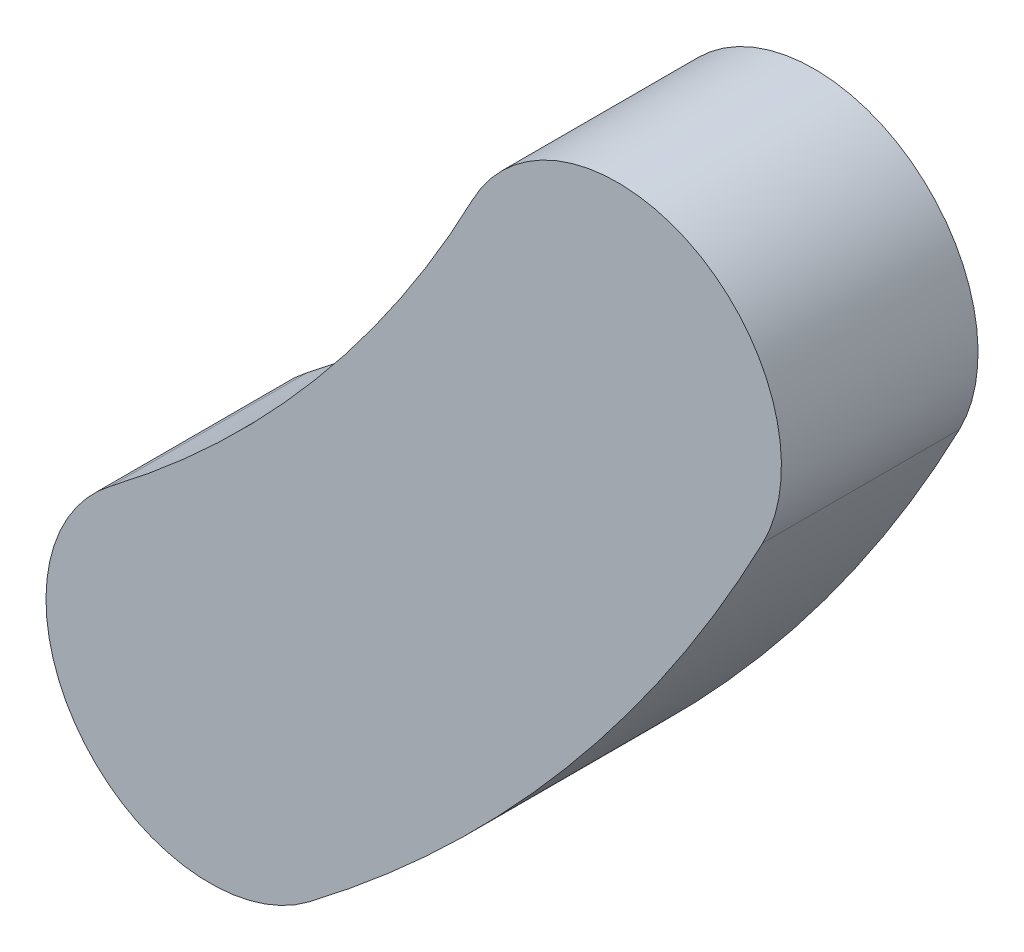
ISO-10303-21;
HEADER;
FILE_DESCRIPTION(('STEP AP214'),'2;1');
FILE_NAME('part.step','',(''),(''),'','','');
FILE_SCHEMA(('AUTOMOTIVE_DESIGN { 1 0 10303 214 1 1 1 1 }'));
ENDSEC;
DATA;
#1=APPLICATION_CONTEXT('core data for automotive mechanical design processes');
#2=APPLICATION_PROTOCOL_DEFINITION('international standard','automotive_design',2000,#1);
#3=PRODUCT_CONTEXT('',#1,'mechanical');
#4=PRODUCT('Part','Part','',(#3));
#5=PRODUCT_RELATED_PRODUCT_CATEGORY('part','',(#4));
#6=PRODUCT_DEFINITION_FORMATION('','',#4);
#7=PRODUCT_DEFINITION_CONTEXT('part definition',#1,'design');
#8=PRODUCT_DEFINITION('design','',#6,#7);
#9=PRODUCT_DEFINITION_SHAPE('','',#8);
#10=(LENGTH_UNIT() NAMED_UNIT(*) SI_UNIT(.MILLI.,.METRE.));
#11=(NAMED_UNIT(*) PLANE_ANGLE_UNIT() SI_UNIT($,.RADIAN.));
#12=(NAMED_UNIT(*) SI_UNIT($,.STERADIAN.) SOLID_ANGLE_UNIT());
#13=UNCERTAINTY_MEASURE_WITH_UNIT(LENGTH_MEASURE(1.E-05),#10,'distance_accuracy_value','');
#14=(GEOMETRIC_REPRESENTATION_CONTEXT(3) GLOBAL_UNCERTAINTY_ASSIGNED_CONTEXT((#13)) GLOBAL_UNIT_ASSIGNED_CONTEXT((#10,
#11,#12)) REPRESENTATION_CONTEXT('',''));
#15=CARTESIAN_POINT('',(0.,0.,0.));
#16=DIRECTION('',(0.,0.,1.));
#17=DIRECTION('',(1.,0.,0.));
#18=AXIS2_PLACEMENT_3D('',#15,#16,#17);
#19=CARTESIAN_POINT('',(60.4075486257416,-1.99000968745045,3.));
#20=DIRECTION('',(0.,0.,-1.));
#21=DIRECTION('',(-1.,0.,0.));
#22=AXIS2_PLACEMENT_3D('',#19,#20,#21);
#23=CYLINDRICAL_SURFACE('',#22,2.49999966);
#24=CARTESIAN_POINT('',(60.4075486257416,-1.99000968745045,0.));
#25=DIRECTION('',(0.,0.,1.));
#26=DIRECTION('',(1.,0.,0.));
#27=AXIS2_PLACEMENT_3D('',#24,#25,#26);
#28=CIRCLE('',#27,2.49999966);
#29=CARTESIAN_POINT('',(58.8945620514359,0.000183751884211963,0.));
#30=VERTEX_POINT('',#29);
#31=CARTESIAN_POINT('',(61.9205352000473,-3.98020312678512,0.));
#32=VERTEX_POINT('',#31);
#33=EDGE_CURVE('E98',#30,#32,#28,.T.);
#34=ORIENTED_EDGE('',*,*,#33,.T.);
#35=DIRECTION('',(0.,0.,-1.));
#36=VECTOR('',#35,1.);
#37=CARTESIAN_POINT('',(61.9205352000473,-3.98020312678512,3.));
#38=LINE('',#37,#36);
#39=CARTESIAN_POINT('',(61.9205352000473,-3.98020312678512,3.));
#40=VERTEX_POINT('',#39);
#41=EDGE_CURVE('E11',#40,#32,#38,.T.);
#42=ORIENTED_EDGE('',*,*,#41,.F.);
#43=CARTESIAN_POINT('',(60.4075486257416,-1.99000968745045,3.));
#44=DIRECTION('',(0.,0.,1.));
#45=DIRECTION('',(1.,0.,0.));
#46=AXIS2_PLACEMENT_3D('',#43,#44,#45);
#47=CIRCLE('',#46,2.49999966);
#48=CARTESIAN_POINT('',(58.8945620514359,0.000183751884211963,3.));
#49=VERTEX_POINT('',#48);
#50=EDGE_CURVE('E86',#49,#40,#47,.T.);
#51=ORIENTED_EDGE('',*,*,#50,.F.);
#52=DIRECTION('',(0.,0.,-1.));
#53=VECTOR('',#52,1.);
#54=CARTESIAN_POINT('',(58.8945620514359,0.000183751884211963,3.));
#55=LINE('',#54,#53);
#56=EDGE_CURVE('E94',#49,#30,#55,.T.);
#57=ORIENTED_EDGE('',*,*,#56,.T.);
#58=EDGE_LOOP('',(#34,#42,#51,#57));
#59=FACE_BOUND('',#58,.T.);
#60=ADVANCED_FACE('F35',(#59),#23,.T.);
#61=CARTESIAN_POINT('',(47.0215048090908,15.61808878148,3.));
#62=DIRECTION('',(0.,0.,-1.));
#63=DIRECTION('',(-1.,0.,0.));
#64=AXIS2_PLACEMENT_3D('',#61,#62,#63);
#65=CYLINDRICAL_SURFACE('',#64,24.61857332);
#66=CARTESIAN_POINT('',(47.0215048090908,15.61808878148,0.));
#67=DIRECTION('',(0.,0.,1.));
#68=DIRECTION('',(1.,0.,0.));
#69=AXIS2_PLACEMENT_3D('',#66,#67,#68);
#70=CIRCLE('',#69,24.61857332);
#71=CARTESIAN_POINT('',(68.844758720277,4.22424215094673,0.));
#72=VERTEX_POINT('',#71);
#73=EDGE_CURVE('E90',#32,#72,#70,.T.);
#74=ORIENTED_EDGE('',*,*,#73,.T.);
#75=DIRECTION('',(0.,0.,-1.));
#76=VECTOR('',#75,1.);
#77=CARTESIAN_POINT('',(68.844758720277,4.22424215094673,3.));
#78=LINE('',#77,#76);
#79=CARTESIAN_POINT('',(68.844758720277,4.22424215094673,3.));
#80=VERTEX_POINT('',#79);
#81=EDGE_CURVE('E43',#80,#72,#78,.T.);
#82=ORIENTED_EDGE('',*,*,#81,.F.);
#83=CARTESIAN_POINT('',(47.0215048090908,15.61808878148,3.));
#84=DIRECTION('',(0.,0.,1.));
#85=DIRECTION('',(1.,0.,0.));
#86=AXIS2_PLACEMENT_3D('',#83,#84,#85);
#87=CIRCLE('',#86,24.61857332);
#88=EDGE_CURVE('E81',#40,#80,#87,.T.);
#89=ORIENTED_EDGE('',*,*,#88,.F.);
#90=ORIENTED_EDGE('',*,*,#41,.T.);
#91=EDGE_LOOP('',(#74,#82,#89,#90));
#92=FACE_BOUND('',#91,.T.);
#93=ADVANCED_FACE('F89',(#92),#65,.T.);
#94=CARTESIAN_POINT('',(66.6286218772156,5.38127965804242,3.));
#95=DIRECTION('',(0.,0.,-1.));
#96=DIRECTION('',(-1.,0.,0.));
#97=AXIS2_PLACEMENT_3D('',#94,#95,#96);
#98=CYLINDRICAL_SURFACE('',#97,2.49999966);
#99=CARTESIAN_POINT('',(66.6286218772156,5.38127965804242,0.));
#100=DIRECTION('',(0.,0.,1.));
#101=DIRECTION('',(1.,0.,0.));
#102=AXIS2_PLACEMENT_3D('',#99,#100,#101);
#103=CIRCLE('',#102,2.49999966);
#104=CARTESIAN_POINT('',(64.4124850341543,6.53831716513811,0.));
#105=VERTEX_POINT('',#104);
#106=EDGE_CURVE('E68',#72,#105,#103,.T.);
#107=ORIENTED_EDGE('',*,*,#106,.T.);
#108=DIRECTION('',(0.,0.,-1.));
#109=VECTOR('',#108,1.);
#110=CARTESIAN_POINT('',(64.4124850341543,6.53831716513811,3.));
#111=LINE('',#110,#109);
#112=CARTESIAN_POINT('',(64.4124850341543,6.53831716513811,3.));
#113=VERTEX_POINT('',#112);
#114=EDGE_CURVE('E91',#113,#105,#111,.T.);
#115=ORIENTED_EDGE('',*,*,#114,.F.);
#116=CARTESIAN_POINT('',(66.6286218772156,5.38127965804242,3.));
#117=DIRECTION('',(0.,0.,1.));
#118=DIRECTION('',(1.,0.,0.));
#119=AXIS2_PLACEMENT_3D('',#116,#117,#118);
#120=CIRCLE('',#119,2.49999966);
#121=EDGE_CURVE('E84',#80,#113,#120,.T.);
#122=ORIENTED_EDGE('',*,*,#121,.F.);
#123=ORIENTED_EDGE('',*,*,#81,.T.);
#124=EDGE_LOOP('',(#107,#115,#122,#123));
#125=FACE_BOUND('',#124,.T.);
#126=ADVANCED_FACE('F92',(#125),#98,.T.);
#127=CARTESIAN_POINT('',(47.0215048090908,15.61808878148,3.));
#128=DIRECTION('',(0.,0.,-1.));
#129=DIRECTION('',(-1.,0.,0.));
#130=AXIS2_PLACEMENT_3D('',#127,#128,#129);
#131=CYLINDRICAL_SURFACE('',#130,19.618574);
#132=CARTESIAN_POINT('',(47.0215048090908,15.61808878148,0.));
#133=DIRECTION('',(0.,0.,-1.));
#134=DIRECTION('',(1.,0.,0.));
#135=AXIS2_PLACEMENT_3D('',#132,#133,#134);
#136=CIRCLE('',#135,19.618574);
#137=EDGE_CURVE('E74',#105,#30,#136,.T.);
#138=ORIENTED_EDGE('',*,*,#137,.T.);
#139=ORIENTED_EDGE('',*,*,#56,.F.);
#140=CARTESIAN_POINT('',(47.0215048090908,15.61808878148,3.));
#141=DIRECTION('',(0.,0.,-1.));
#142=DIRECTION('',(1.,0.,0.));
#143=AXIS2_PLACEMENT_3D('',#140,#141,#142);
#144=CIRCLE('',#143,19.618574);
#145=EDGE_CURVE('E51',#113,#49,#144,.T.);
#146=ORIENTED_EDGE('',*,*,#145,.F.);
#147=ORIENTED_EDGE('',*,*,#114,.T.);
#148=EDGE_LOOP('',(#138,#139,#146,#147));
#149=FACE_BOUND('',#148,.T.);
#150=ADVANCED_FACE('F105',(#149),#131,.F.);
#151=CARTESIAN_POINT('',(53.7145267174162,6.81403954701476,3.));
#152=DIRECTION('',(0.,0.,1.));
#153=DIRECTION('',(1.,0.,0.));
#154=AXIS2_PLACEMENT_3D('',#151,#152,#153);
#155=PLANE('',#154);
#156=ORIENTED_EDGE('',*,*,#50,.T.);
#157=ORIENTED_EDGE('',*,*,#88,.T.);
#158=ORIENTED_EDGE('',*,*,#121,.T.);
#159=ORIENTED_EDGE('',*,*,#145,.T.);
#160=EDGE_LOOP('',(#156,#157,#158,#159));
#161=FACE_BOUND('',#160,.T.);
#162=ADVANCED_FACE('F82',(#161),#155,.T.);
#163=CARTESIAN_POINT('',(53.7145267174162,6.81403954701476,0.));
#164=DIRECTION('',(0.,0.,1.));
#165=DIRECTION('',(1.,0.,0.));
#166=AXIS2_PLACEMENT_3D('',#163,#164,#165);
#167=PLANE('',#166);
#168=ORIENTED_EDGE('',*,*,#33,.F.);
#169=ORIENTED_EDGE('',*,*,#137,.F.);
#170=ORIENTED_EDGE('',*,*,#106,.F.);
#171=ORIENTED_EDGE('',*,*,#73,.F.);
#172=EDGE_LOOP('',(#168,#169,#170,#171));
#173=FACE_BOUND('',#172,.T.);
#174=ADVANCED_FACE('F108',(#173),#167,.F.);
#175=CLOSED_SHELL('',(#60,#93,#126,#150,#162,#174));
#176=MANIFOLD_SOLID_BREP('B2',#175);
#177=ADVANCED_BREP_SHAPE_REPRESENTATION('',(#18,#176),#14);
#178=SHAPE_DEFINITION_REPRESENTATION(#9,#177);
ENDSEC;
END-ISO-10303-21;
